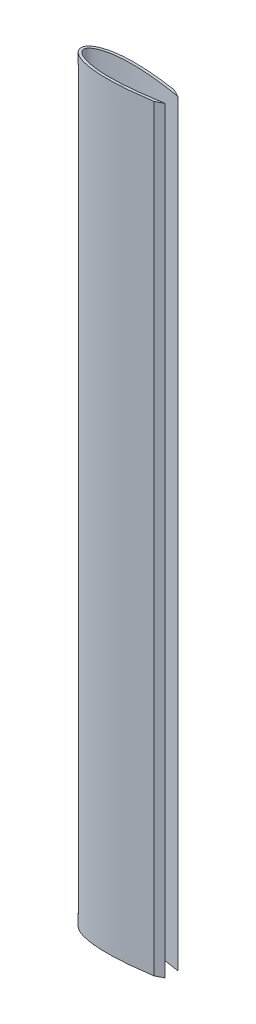
ISO-10303-21;
HEADER;
FILE_DESCRIPTION(('STEP AP214'),'2;1');
FILE_NAME('part.step','',(''),(''),'','','');
FILE_SCHEMA(('AUTOMOTIVE_DESIGN { 1 0 10303 214 1 1 1 1 }'));
ENDSEC;
DATA;
#1=APPLICATION_CONTEXT('core data for automotive mechanical design processes');
#2=APPLICATION_PROTOCOL_DEFINITION('international standard','automotive_design',2000,#1);
#3=PRODUCT_CONTEXT('',#1,'mechanical');
#4=PRODUCT('Part','Part','',(#3));
#5=PRODUCT_RELATED_PRODUCT_CATEGORY('part','',(#4));
#6=PRODUCT_DEFINITION_FORMATION('','',#4);
#7=PRODUCT_DEFINITION_CONTEXT('part definition',#1,'design');
#8=PRODUCT_DEFINITION('design','',#6,#7);
#9=PRODUCT_DEFINITION_SHAPE('','',#8);
#10=(LENGTH_UNIT() NAMED_UNIT(*) SI_UNIT(.MILLI.,.METRE.));
#11=(NAMED_UNIT(*) PLANE_ANGLE_UNIT() SI_UNIT($,.RADIAN.));
#12=(NAMED_UNIT(*) SI_UNIT($,.STERADIAN.) SOLID_ANGLE_UNIT());
#13=UNCERTAINTY_MEASURE_WITH_UNIT(LENGTH_MEASURE(1.E-05),#10,'distance_accuracy_value','');
#14=(GEOMETRIC_REPRESENTATION_CONTEXT(3) GLOBAL_UNCERTAINTY_ASSIGNED_CONTEXT((#13)) GLOBAL_UNIT_ASSIGNED_CONTEXT((#10,
#11,#12)) REPRESENTATION_CONTEXT('',''));
#15=CARTESIAN_POINT('',(0.,0.,0.));
#16=DIRECTION('',(0.,0.,1.));
#17=DIRECTION('',(1.,0.,0.));
#18=AXIS2_PLACEMENT_3D('',#15,#16,#17);
#19=CARTESIAN_POINT('',(27.3102353999989,1000.,54.4936309518719));
#20=DIRECTION('',(-0.44804576460063,0.,-0.894010622321366));
#21=DIRECTION('',(-0.894010622321366,0.,0.44804576460063));
#22=AXIS2_PLACEMENT_3D('',#19,#20,#21);
#23=PLANE('',#22);
#24=DIRECTION('',(0.894010622321366,0.,-0.44804576460063));
#25=VECTOR('',#24,1.);
#26=CARTESIAN_POINT('',(27.3102353999989,0.,54.4936309518719));
#27=LINE('',#26,#25);
#28=CARTESIAN_POINT('',(109.462602502943,0.,13.321838119237));
#29=VERTEX_POINT('',#28);
#30=CARTESIAN_POINT('',(119.460181569461,0.,8.3114133600967));
#31=VERTEX_POINT('',#30);
#32=EDGE_CURVE('E115',#29,#31,#27,.T.);
#33=ORIENTED_EDGE('',*,*,#32,.T.);
#34=DIRECTION('',(0.,-1.,0.));
#35=VECTOR('',#34,1.);
#36=CARTESIAN_POINT('',(119.460181569461,1000.,8.3114133600967));
#37=LINE('',#36,#35);
#38=CARTESIAN_POINT('',(119.460181569461,1000.,8.3114133600967));
#39=VERTEX_POINT('',#38);
#40=EDGE_CURVE('E11',#39,#31,#37,.T.);
#41=ORIENTED_EDGE('',*,*,#40,.F.);
#42=DIRECTION('',(0.894010622321366,0.,-0.44804576460063));
#43=VECTOR('',#42,1.);
#44=CARTESIAN_POINT('',(27.3102353999989,1000.,54.4936309518719));
#45=LINE('',#44,#43);
#46=CARTESIAN_POINT('',(109.462602502943,1000.,13.321838119237));
#47=VERTEX_POINT('',#46);
#48=EDGE_CURVE('E91',#47,#39,#45,.T.);
#49=ORIENTED_EDGE('',*,*,#48,.F.);
#50=DIRECTION('',(0.,-1.,0.));
#51=VECTOR('',#50,1.);
#52=CARTESIAN_POINT('',(109.462602502943,1000.,13.321838119237));
#53=LINE('',#52,#51);
#54=EDGE_CURVE('E58',#47,#29,#53,.T.);
#55=ORIENTED_EDGE('',*,*,#54,.T.);
#56=EDGE_LOOP('',(#33,#41,#49,#55));
#57=FACE_BOUND('',#56,.T.);
#58=ADVANCED_FACE('F41',(#57),#23,.F.);
#59=CARTESIAN_POINT('',(128.86509987924,1000.,6.67831133086379));
#60=CARTESIAN_POINT('',(123.280336880275,1000.,7.68289390214582));
#61=CARTESIAN_POINT('',(112.08463017396,1000.,9.577731816888));
#62=CARTESIAN_POINT('',(95.2528054478271,1000.,11.9840955505401));
#63=CARTESIAN_POINT('',(78.3697813783868,1000.,13.8507150546171));
#64=CARTESIAN_POINT('',(61.4696146349368,1000.,15.0124746147564));
#65=CARTESIAN_POINT('',(49.0102131309953,1000.,15.0793320701064));
#66=CARTESIAN_POINT('',(40.8155334965545,1000.,14.6704700844346));
#67=CARTESIAN_POINT('',(37.5234182982148,1000.,14.4260778418877));
#68=CARTESIAN_POINT('',(33.1891480869755,1000.,14.0054926158607));
#69=CARTESIAN_POINT('',(27.5148690749984,1000.,13.2565844413664));
#70=CARTESIAN_POINT('',(21.2800242094185,1000.,11.971608567481));
#71=CARTESIAN_POINT('',(16.1096371917738,1000.,10.40436601114));
#72=CARTESIAN_POINT('',(12.3687776850727,1000.,8.96998413825623));
#73=CARTESIAN_POINT('',(9.49630720387504,1000.,7.51167197896818));
#74=CARTESIAN_POINT('',(7.43385551503185,1000.,6.14778396321417));
#75=CARTESIAN_POINT('',(6.01457991492973,1000.,5.00734606538994));
#76=CARTESIAN_POINT('',(4.90107333078198,1000.,3.86391896615194));
#77=CARTESIAN_POINT('',(4.04445047306127,1000.,2.57969063458066));
#78=CARTESIAN_POINT('',(3.58134529045564,1000.,1.43849944995542));
#79=CARTESIAN_POINT('',(3.40348803425921,1000.,0.583515701646176));
#80=CARTESIAN_POINT('',(3.36075598286891,1000.,-1.84376981997997E-11));
#81=CARTESIAN_POINT('',(3.40348803426515,1000.,-0.583515701688927));
#82=CARTESIAN_POINT('',(3.58134529047008,1000.,-1.43849945000078));
#83=CARTESIAN_POINT('',(4.04445047308653,1000.,-2.57969063462784));
#84=CARTESIAN_POINT('',(4.90107333081437,1000.,-3.86391896619153));
#85=CARTESIAN_POINT('',(6.01457991497404,1000.,-5.00734606542951));
#86=CARTESIAN_POINT('',(7.43385551508252,1000.,-6.14778396325104));
#87=CARTESIAN_POINT('',(9.49630720393158,1000.,-7.51167197900024));
#88=CARTESIAN_POINT('',(12.3687776851343,1000.,-8.96998413828295));
#89=CARTESIAN_POINT('',(16.1096371918391,1000.,-10.4043660111623));
#90=CARTESIAN_POINT('',(21.2800242094862,1000.,-11.9716085674975));
#91=CARTESIAN_POINT('',(27.5148690750452,1000.,-13.2565844413733));
#92=CARTESIAN_POINT('',(33.1891480869992,1000.,-14.005492615863));
#93=CARTESIAN_POINT('',(37.5234182982148,1000.,-14.4260778418877));
#94=CARTESIAN_POINT('',(40.8155334965782,1000.,-14.6704700844363));
#95=CARTESIAN_POINT('',(49.0102131310433,1000.,-15.0793320701076));
#96=CARTESIAN_POINT('',(61.4696146350087,1000.,-15.0124746147534));
#97=CARTESIAN_POINT('',(78.3697813784589,1000.,-13.8507150546104));
#98=CARTESIAN_POINT('',(95.252805447899,1000.,-11.9840955505309));
#99=CARTESIAN_POINT('',(108.153908630142,1000.,-10.1396878688325));
#100=CARTESIAN_POINT('',(117.002736817863,1000.,-8.72295771602549));
#101=CARTESIAN_POINT('',(122.599653080762,1000.,-7.78676271610494));
#102=CARTESIAN_POINT('',(126.517531064254,1000.,-7.10059007695542));
#103=CARTESIAN_POINT('',(128.865099879311,1000.,-6.67831133085094));
#104=B_SPLINE_CURVE_WITH_KNOTS('',3,(#59,#60,#61,#62,#63,#64,#65,#66,#67,#68,#69,#70,#71,#72,
#73,#74,#75,#76,#77,#78,#79,#80,#81,#82,#83,#84,#85,#86,#87,#88,#89,#90,#91,#92,#93,#94,#95,#96,
#97,#98,#99,#100,#101,#102,#103),.UNSPECIFIED.,.F.,.F.,(4,1,1,1,1,1,1,1,1,1,1,1,1,1,1,1,1,1,1,1,
1,1,1,1,1,1,1,1,1,1,1,1,1,1,1,1,1,1,1,1,1,1,4),(0.126932810335758,0.173566209043801,
0.220199607751844,0.266833006459886,0.313466405167929,0.360099803875972,0.370224419378263,
0.381882769055274,0.387711943893779,0.406733202584014,0.430049901938035,0.441708251615046,
0.453366601292057,0.465024950969067,0.470854125807573,0.476683300646078,0.482512475484583,
0.488341650323089,0.494170825161594,0.497085412580847,0.500000000000099,0.502914587419352,
0.505829174838605,0.51165834967711,0.517487524515615,0.523316699354121,0.529145874192626,
0.534975049031131,0.546633398708142,0.558291748385153,0.569950098062163,0.593266797416185,
0.612288056106221,0.618117230944726,0.629775580621737,0.639900196124227,0.68653359483227,
0.733166993540313,0.779800392248355,0.826433790956398,0.840396417252835,0.853464726217477,
0.87306718966444),.UNSPECIFIED.);
#105=DIRECTION('',(0.,-1.,0.));
#106=VECTOR('',#105,1.);
#107=SURFACE_OF_LINEAR_EXTRUSION('',#104,#106);
#108=CARTESIAN_POINT('',(128.86509987924,0.,6.67831133086379));
#109=CARTESIAN_POINT('',(123.280336880275,0.,7.68289390214582));
#110=CARTESIAN_POINT('',(112.08463017396,0.,9.577731816888));
#111=CARTESIAN_POINT('',(95.2528054478271,0.,11.9840955505401));
#112=CARTESIAN_POINT('',(78.3697813783868,0.,13.8507150546171));
#113=CARTESIAN_POINT('',(61.4696146349368,0.,15.0124746147564));
#114=CARTESIAN_POINT('',(49.0102131309953,0.,15.0793320701064));
#115=CARTESIAN_POINT('',(40.8155334965545,0.,14.6704700844346));
#116=CARTESIAN_POINT('',(37.5234182982148,0.,14.4260778418877));
#117=CARTESIAN_POINT('',(33.1891480869755,0.,14.0054926158607));
#118=CARTESIAN_POINT('',(27.5148690749984,0.,13.2565844413664));
#119=CARTESIAN_POINT('',(21.2800242094185,0.,11.971608567481));
#120=CARTESIAN_POINT('',(16.1096371917738,0.,10.40436601114));
#121=CARTESIAN_POINT('',(12.3687776850727,0.,8.96998413825623));
#122=CARTESIAN_POINT('',(9.49630720387504,0.,7.51167197896818));
#123=CARTESIAN_POINT('',(7.43385551503185,0.,6.14778396321417));
#124=CARTESIAN_POINT('',(6.01457991492973,0.,5.00734606538994));
#125=CARTESIAN_POINT('',(4.90107333078198,0.,3.86391896615194));
#126=CARTESIAN_POINT('',(4.04445047306127,0.,2.57969063458066));
#127=CARTESIAN_POINT('',(3.58134529045564,0.,1.43849944995542));
#128=CARTESIAN_POINT('',(3.40348803425921,0.,0.583515701646176));
#129=CARTESIAN_POINT('',(3.36075598286891,0.,-1.84376981997997E-11));
#130=CARTESIAN_POINT('',(3.40348803426515,0.,-0.583515701688927));
#131=CARTESIAN_POINT('',(3.58134529047008,0.,-1.43849945000078));
#132=CARTESIAN_POINT('',(4.04445047308653,0.,-2.57969063462784));
#133=CARTESIAN_POINT('',(4.90107333081437,0.,-3.86391896619153));
#134=CARTESIAN_POINT('',(6.01457991497404,0.,-5.00734606542951));
#135=CARTESIAN_POINT('',(7.43385551508252,0.,-6.14778396325104));
#136=CARTESIAN_POINT('',(9.49630720393158,0.,-7.51167197900024));
#137=CARTESIAN_POINT('',(12.3687776851343,0.,-8.96998413828295));
#138=CARTESIAN_POINT('',(16.1096371918391,0.,-10.4043660111623));
#139=CARTESIAN_POINT('',(21.2800242094862,0.,-11.9716085674975));
#140=CARTESIAN_POINT('',(27.5148690750452,0.,-13.2565844413733));
#141=CARTESIAN_POINT('',(33.1891480869992,0.,-14.005492615863));
#142=CARTESIAN_POINT('',(37.5234182982148,0.,-14.4260778418877));
#143=CARTESIAN_POINT('',(40.8155334965782,0.,-14.6704700844363));
#144=CARTESIAN_POINT('',(49.0102131310433,0.,-15.0793320701076));
#145=CARTESIAN_POINT('',(61.4696146350087,0.,-15.0124746147534));
#146=CARTESIAN_POINT('',(78.3697813784589,0.,-13.8507150546104));
#147=CARTESIAN_POINT('',(95.252805447899,0.,-11.9840955505309));
#148=CARTESIAN_POINT('',(108.153908630142,0.,-10.1396878688325));
#149=CARTESIAN_POINT('',(117.002736817863,0.,-8.72295771602549));
#150=CARTESIAN_POINT('',(122.599653080762,0.,-7.78676271610494));
#151=CARTESIAN_POINT('',(126.517531064254,0.,-7.10059007695542));
#152=CARTESIAN_POINT('',(128.865099879311,0.,-6.67831133085094));
#153=B_SPLINE_CURVE_WITH_KNOTS('',3,(#108,#109,#110,#111,#112,#113,#114,#115,#116,#117,#118,
#119,#120,#121,#122,#123,#124,#125,#126,#127,#128,#129,#130,#131,#132,#133,#134,#135,#136,#137,
#138,#139,#140,#141,#142,#143,#144,#145,#146,#147,#148,#149,#150,#151,#152),.UNSPECIFIED.,.F.,
.F.,(4,1,1,1,1,1,1,1,1,1,1,1,1,1,1,1,1,1,1,1,1,1,1,1,1,1,1,1,1,1,1,1,1,1,1,1,1,1,1,1,1,1,4),
(0.126932810335758,0.173566209043801,0.220199607751844,0.266833006459886,0.313466405167929,
0.360099803875972,0.370224419378263,0.381882769055274,0.387711943893779,0.406733202584014,
0.430049901938035,0.441708251615046,0.453366601292057,0.465024950969067,0.470854125807573,
0.476683300646078,0.482512475484583,0.488341650323089,0.494170825161594,0.497085412580847,
0.500000000000099,0.502914587419352,0.505829174838605,0.51165834967711,0.517487524515615,
0.523316699354121,0.529145874192626,0.534975049031131,0.546633398708142,0.558291748385153,
0.569950098062163,0.593266797416185,0.612288056106221,0.618117230944726,0.629775580621737,
0.639900196124227,0.68653359483227,0.733166993540313,0.779800392248355,0.826433790956398,
0.840396417252835,0.853464726217477,0.87306718966444),.UNSPECIFIED.);
#154=CARTESIAN_POINT('',(119.462602502942,0.,-8.31020007586356));
#155=VERTEX_POINT('',#154);
#156=EDGE_CURVE('E97',#31,#155,#153,.T.);
#157=ORIENTED_EDGE('',*,*,#156,.T.);
#158=DIRECTION('',(0.,-1.,0.));
#159=VECTOR('',#158,1.);
#160=CARTESIAN_POINT('',(119.462602502942,1000.,-8.31020007586356));
#161=LINE('',#160,#159);
#162=CARTESIAN_POINT('',(119.462602502942,1000.,-8.31020007586356));
#163=VERTEX_POINT('',#162);
#164=EDGE_CURVE('E50',#163,#155,#161,.T.);
#165=ORIENTED_EDGE('',*,*,#164,.F.);
#166=EDGE_CURVE('E83',#39,#163,#104,.T.);
#167=ORIENTED_EDGE('',*,*,#166,.F.);
#168=ORIENTED_EDGE('',*,*,#40,.T.);
#169=EDGE_LOOP('',(#157,#165,#167,#168));
#170=FACE_BOUND('',#169,.T.);
#171=ADVANCED_FACE('F96',(#170),#107,.F.);
#172=CARTESIAN_POINT('',(27.3102353999989,1000.,-54.4936309518719));
#173=DIRECTION('',(0.44804576460063,0.,-0.894010622321366));
#174=DIRECTION('',(-0.894010622321366,0.,-0.44804576460063));
#175=AXIS2_PLACEMENT_3D('',#172,#173,#174);
#176=PLANE('',#175);
#177=DIRECTION('',(0.894010622321366,0.,0.44804576460063));
#178=VECTOR('',#177,1.);
#179=CARTESIAN_POINT('',(27.3102353999989,0.,-54.4936309518719));
#180=LINE('',#179,#178);
#181=CARTESIAN_POINT('',(109.462602502943,0.,-13.321838119237));
#182=VERTEX_POINT('',#181);
#183=EDGE_CURVE('E138',#182,#155,#180,.T.);
#184=ORIENTED_EDGE('',*,*,#183,.F.);
#185=DIRECTION('',(0.,-1.,0.));
#186=VECTOR('',#185,1.);
#187=CARTESIAN_POINT('',(109.462602502943,1000.,-13.321838119237));
#188=LINE('',#187,#186);
#189=CARTESIAN_POINT('',(109.462602502943,1000.,-13.321838119237));
#190=VERTEX_POINT('',#189);
#191=EDGE_CURVE('E72',#190,#182,#188,.T.);
#192=ORIENTED_EDGE('',*,*,#191,.F.);
#193=DIRECTION('',(0.894010622321366,0.,0.44804576460063));
#194=VECTOR('',#193,1.);
#195=CARTESIAN_POINT('',(27.3102353999989,1000.,-54.4936309518719));
#196=LINE('',#195,#194);
#197=EDGE_CURVE('E90',#190,#163,#196,.T.);
#198=ORIENTED_EDGE('',*,*,#197,.T.);
#199=ORIENTED_EDGE('',*,*,#164,.T.);
#200=EDGE_LOOP('',(#184,#192,#198,#199));
#201=FACE_BOUND('',#200,.T.);
#202=ADVANCED_FACE('F101',(#201),#176,.T.);
#203=CARTESIAN_POINT('',(175.,1000.,0.39));
#204=CARTESIAN_POINT('',(172.085241496105,1000.,1.09152222163685));
#205=CARTESIAN_POINT('',(166.264472280498,1000.,2.49246125185534));
#206=CARTESIAN_POINT('',(154.607927016759,1000.,5.09156086592904));
#207=CARTESIAN_POINT('',(140.038420725842,1000.,8.09140178181942));
#208=CARTESIAN_POINT('',(122.535042854394,1000.,11.2821230064872));
#209=CARTESIAN_POINT('',(105.037393495559,1000.,14.0632493150311));
#210=CARTESIAN_POINT('',(87.5357161431583,1000.,16.3132168120485));
#211=CARTESIAN_POINT('',(70.0312566500619,1000.,17.9204898310831));
#212=CARTESIAN_POINT('',(55.419740469257,1000.,18.4982066928849));
#213=CARTESIAN_POINT('',(43.7407108118965,1000.,18.258850491133));
#214=CARTESIAN_POINT('',(34.9708529287554,1000.,17.6628258116294));
#215=CARTESIAN_POINT('',(26.1802751432632,1000.,16.4887429445533));
#216=CARTESIAN_POINT('',(18.8668230003246,1000.,14.8560268440333));
#217=CARTESIAN_POINT('',(13.046149977675,1000.,12.9027308755909));
#218=CARTESIAN_POINT('',(8.56770494081301,1000.,10.9405914254921));
#219=CARTESIAN_POINT('',(4.83764635167303,1000.,8.55999701237394));
#220=CARTESIAN_POINT('',(1.35145933097624,1000.,5.19217289134011));
#221=CARTESIAN_POINT('',(-0.899864039851692,1000.,0.));
#222=CARTESIAN_POINT('',(1.35145933097622,1000.,-5.19217289134009));
#223=CARTESIAN_POINT('',(4.83764635167304,1000.,-8.55999701237396));
#224=CARTESIAN_POINT('',(8.56770494081301,1000.,-10.9405914254921));
#225=CARTESIAN_POINT('',(13.0461499776749,1000.,-12.9027308755909));
#226=CARTESIAN_POINT('',(18.8668230003246,1000.,-14.8560268440333));
#227=CARTESIAN_POINT('',(26.1802751432632,1000.,-16.4887429445533));
#228=CARTESIAN_POINT('',(34.9708529287554,1000.,-17.6628258116294));
#229=CARTESIAN_POINT('',(43.7407108118966,1000.,-18.258850491133));
#230=CARTESIAN_POINT('',(55.4197404692569,1000.,-18.4982066928849));
#231=CARTESIAN_POINT('',(70.031256650062,1000.,-17.9204898310831));
#232=CARTESIAN_POINT('',(87.5357161431582,1000.,-16.3132168120485));
#233=CARTESIAN_POINT('',(105.037393495559,1000.,-14.0632493150311));
#234=CARTESIAN_POINT('',(122.535042854394,1000.,-11.2821230064872));
#235=CARTESIAN_POINT('',(140.038420725843,1000.,-8.09140178181943));
#236=CARTESIAN_POINT('',(154.607927016759,1000.,-5.09156086592902));
#237=CARTESIAN_POINT('',(166.264472280498,1000.,-2.49246125185535));
#238=CARTESIAN_POINT('',(172.085241496105,1000.,-1.09152222163685));
#239=CARTESIAN_POINT('',(175.,1000.,-0.39));
#240=B_SPLINE_CURVE_WITH_KNOTS('',3,(#203,#204,#205,#206,#207,#208,#209,#210,#211,#212,#213,
#214,#215,#216,#217,#218,#219,#220,#221,#222,#223,#224,#225,#226,#227,#228,#229,#230,#231,#232,
#233,#234,#235,#236,#237,#238,#239),.UNSPECIFIED.,.F.,.F.,(4,1,1,1,1,1,1,1,1,1,1,1,1,1,1,1,1,1,
1,1,1,1,1,1,1,1,1,1,1,1,1,1,1,1,4),(0.,0.0245260212886547,0.0489784349226685,0.097699960688031,
0.146208565680754,0.194520661661987,0.24262878422404,0.290540245232,0.338291453258691,
0.36215819051928,0.386079128224042,0.410163587326254,0.43465843435882,0.447240238678327,
0.460336948042186,0.474609083480639,0.483093555099328,0.5,0.516906444900672,0.525390916519361,
0.539663051957814,0.552759761321673,0.56534156564118,0.589836412673746,0.613920871775958,
0.63784180948072,0.661708546741309,0.709459754768,0.75737121577596,0.805479338338013,
0.853791434319246,0.902300039311969,0.951021565077331,0.975473978711345,1.),.UNSPECIFIED.);
#241=DIRECTION('',(0.,-1.,0.));
#242=VECTOR('',#241,1.);
#243=SURFACE_OF_LINEAR_EXTRUSION('',#240,#242);
#244=CARTESIAN_POINT('',(175.,0.,0.39));
#245=CARTESIAN_POINT('',(172.085241496105,0.,1.09152222163685));
#246=CARTESIAN_POINT('',(166.264472280498,0.,2.49246125185534));
#247=CARTESIAN_POINT('',(154.607927016759,0.,5.09156086592904));
#248=CARTESIAN_POINT('',(140.038420725842,0.,8.09140178181942));
#249=CARTESIAN_POINT('',(122.535042854394,0.,11.2821230064872));
#250=CARTESIAN_POINT('',(105.037393495559,0.,14.0632493150311));
#251=CARTESIAN_POINT('',(87.5357161431583,0.,16.3132168120485));
#252=CARTESIAN_POINT('',(70.0312566500619,0.,17.9204898310831));
#253=CARTESIAN_POINT('',(55.419740469257,0.,18.4982066928849));
#254=CARTESIAN_POINT('',(43.7407108118965,0.,18.258850491133));
#255=CARTESIAN_POINT('',(34.9708529287554,0.,17.6628258116294));
#256=CARTESIAN_POINT('',(26.1802751432632,0.,16.4887429445533));
#257=CARTESIAN_POINT('',(18.8668230003246,0.,14.8560268440333));
#258=CARTESIAN_POINT('',(13.046149977675,0.,12.9027308755909));
#259=CARTESIAN_POINT('',(8.56770494081301,0.,10.9405914254921));
#260=CARTESIAN_POINT('',(4.83764635167303,0.,8.55999701237394));
#261=CARTESIAN_POINT('',(1.35145933097624,0.,5.19217289134011));
#262=CARTESIAN_POINT('',(-0.899864039851692,0.,0.));
#263=CARTESIAN_POINT('',(1.35145933097622,0.,-5.19217289134009));
#264=CARTESIAN_POINT('',(4.83764635167304,0.,-8.55999701237396));
#265=CARTESIAN_POINT('',(8.56770494081301,0.,-10.9405914254921));
#266=CARTESIAN_POINT('',(13.0461499776749,0.,-12.9027308755909));
#267=CARTESIAN_POINT('',(18.8668230003246,0.,-14.8560268440333));
#268=CARTESIAN_POINT('',(26.1802751432632,0.,-16.4887429445533));
#269=CARTESIAN_POINT('',(34.9708529287554,0.,-17.6628258116294));
#270=CARTESIAN_POINT('',(43.7407108118966,0.,-18.258850491133));
#271=CARTESIAN_POINT('',(55.4197404692569,0.,-18.4982066928849));
#272=CARTESIAN_POINT('',(70.031256650062,0.,-17.9204898310831));
#273=CARTESIAN_POINT('',(87.5357161431582,0.,-16.3132168120485));
#274=CARTESIAN_POINT('',(105.037393495559,0.,-14.0632493150311));
#275=CARTESIAN_POINT('',(122.535042854394,0.,-11.2821230064872));
#276=CARTESIAN_POINT('',(140.038420725843,0.,-8.09140178181943));
#277=CARTESIAN_POINT('',(154.607927016759,0.,-5.09156086592902));
#278=CARTESIAN_POINT('',(166.264472280498,0.,-2.49246125185535));
#279=CARTESIAN_POINT('',(172.085241496105,0.,-1.09152222163685));
#280=CARTESIAN_POINT('',(175.,0.,-0.39));
#281=B_SPLINE_CURVE_WITH_KNOTS('',3,(#244,#245,#246,#247,#248,#249,#250,#251,#252,#253,#254,
#255,#256,#257,#258,#259,#260,#261,#262,#263,#264,#265,#266,#267,#268,#269,#270,#271,#272,#273,
#274,#275,#276,#277,#278,#279,#280),.UNSPECIFIED.,.F.,.F.,(4,1,1,1,1,1,1,1,1,1,1,1,1,1,1,1,1,1,
1,1,1,1,1,1,1,1,1,1,1,1,1,1,1,1,4),(0.,0.0245260212886547,0.0489784349226685,0.097699960688031,
0.146208565680754,0.194520661661987,0.24262878422404,0.290540245232,0.338291453258691,
0.36215819051928,0.386079128224042,0.410163587326254,0.43465843435882,0.447240238678327,
0.460336948042186,0.474609083480639,0.483093555099328,0.5,0.516906444900672,0.525390916519361,
0.539663051957814,0.552759761321673,0.56534156564118,0.589836412673746,0.613920871775958,
0.63784180948072,0.661708546741309,0.709459754768,0.75737121577596,0.805479338338013,
0.853791434319246,0.902300039311969,0.951021565077331,0.975473978711345,1.),.UNSPECIFIED.);
#282=EDGE_CURVE('E140',#29,#182,#281,.T.);
#283=ORIENTED_EDGE('',*,*,#282,.F.);
#284=ORIENTED_EDGE('',*,*,#54,.F.);
#285=EDGE_CURVE('E103',#47,#190,#240,.T.);
#286=ORIENTED_EDGE('',*,*,#285,.T.);
#287=ORIENTED_EDGE('',*,*,#191,.T.);
#288=EDGE_LOOP('',(#283,#284,#286,#287));
#289=FACE_BOUND('',#288,.T.);
#290=ADVANCED_FACE('F121',(#289),#243,.T.);
#291=CARTESIAN_POINT('',(0.,1000.,0.));
#292=DIRECTION('',(0.,1.,0.));
#293=DIRECTION('',(0.,0.,1.));
#294=AXIS2_PLACEMENT_3D('',#291,#292,#293);
#295=PLANE('',#294);
#296=ORIENTED_EDGE('',*,*,#48,.T.);
#297=ORIENTED_EDGE('',*,*,#166,.T.);
#298=ORIENTED_EDGE('',*,*,#197,.F.);
#299=ORIENTED_EDGE('',*,*,#285,.F.);
#300=EDGE_LOOP('',(#296,#297,#298,#299));
#301=FACE_BOUND('',#300,.T.);
#302=ADVANCED_FACE('F87',(#301),#295,.T.);
#303=CARTESIAN_POINT('',(0.,0.,0.));
#304=DIRECTION('',(0.,1.,0.));
#305=DIRECTION('',(0.,0.,1.));
#306=AXIS2_PLACEMENT_3D('',#303,#304,#305);
#307=PLANE('',#306);
#308=ORIENTED_EDGE('',*,*,#32,.F.);
#309=ORIENTED_EDGE('',*,*,#282,.T.);
#310=ORIENTED_EDGE('',*,*,#183,.T.);
#311=ORIENTED_EDGE('',*,*,#156,.F.);
#312=EDGE_LOOP('',(#308,#309,#310,#311));
#313=FACE_BOUND('',#312,.T.);
#314=ADVANCED_FACE('F125',(#313),#307,.F.);
#315=CLOSED_SHELL('',(#58,#171,#202,#290,#302,#314));
#316=MANIFOLD_SOLID_BREP('B2',#315);
#317=ADVANCED_BREP_SHAPE_REPRESENTATION('',(#18,#316),#14);
#318=SHAPE_DEFINITION_REPRESENTATION(#9,#317);
ENDSEC;
END-ISO-10303-21;
